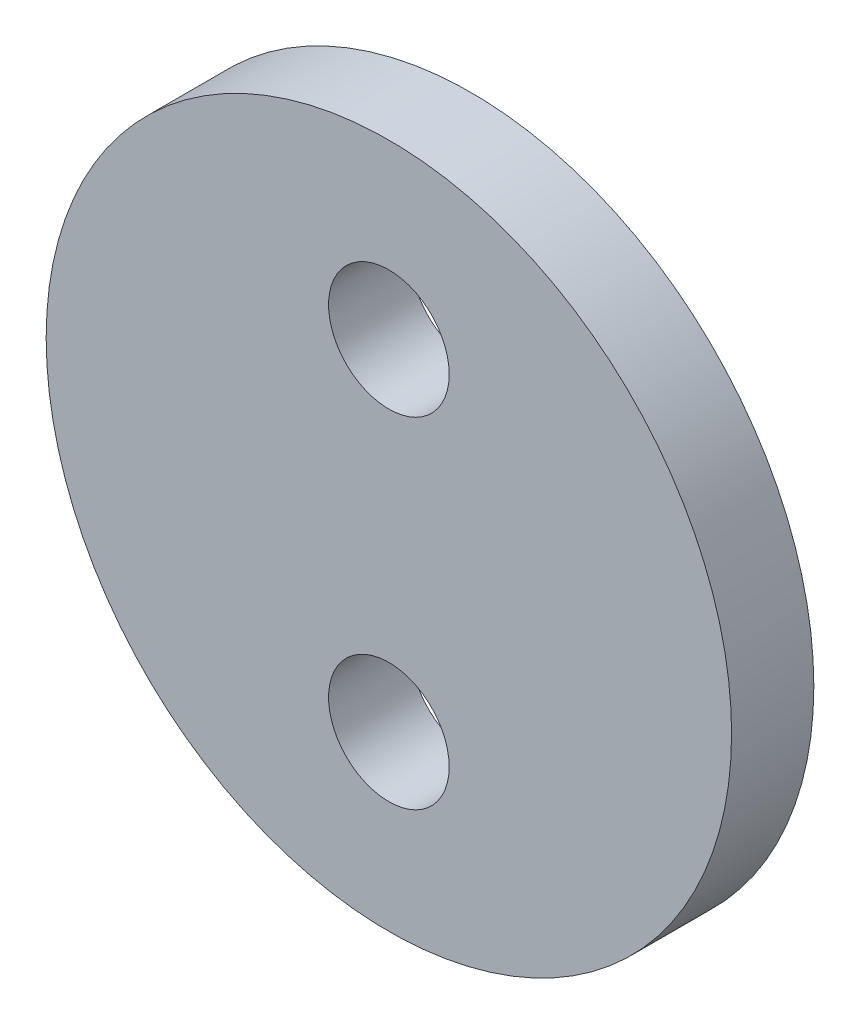
ISO-10303-21;
HEADER;
FILE_DESCRIPTION(('STEP AP214'),'2;1');
FILE_NAME('part.step','',(''),(''),'','','');
FILE_SCHEMA(('AUTOMOTIVE_DESIGN { 1 0 10303 214 1 1 1 1 }'));
ENDSEC;
DATA;
#1=APPLICATION_CONTEXT('core data for automotive mechanical design processes');
#2=APPLICATION_PROTOCOL_DEFINITION('international standard','automotive_design',2000,#1);
#3=PRODUCT_CONTEXT('',#1,'mechanical');
#4=PRODUCT('Part','Part','',(#3));
#5=PRODUCT_RELATED_PRODUCT_CATEGORY('part','',(#4));
#6=PRODUCT_DEFINITION_FORMATION('','',#4);
#7=PRODUCT_DEFINITION_CONTEXT('part definition',#1,'design');
#8=PRODUCT_DEFINITION('design','',#6,#7);
#9=PRODUCT_DEFINITION_SHAPE('','',#8);
#10=(LENGTH_UNIT() NAMED_UNIT(*) SI_UNIT(.MILLI.,.METRE.));
#11=(NAMED_UNIT(*) PLANE_ANGLE_UNIT() SI_UNIT($,.RADIAN.));
#12=(NAMED_UNIT(*) SI_UNIT($,.STERADIAN.) SOLID_ANGLE_UNIT());
#13=UNCERTAINTY_MEASURE_WITH_UNIT(LENGTH_MEASURE(1.E-05),#10,'distance_accuracy_value','');
#14=(GEOMETRIC_REPRESENTATION_CONTEXT(3) GLOBAL_UNCERTAINTY_ASSIGNED_CONTEXT((#13)) GLOBAL_UNIT_ASSIGNED_CONTEXT((#10,
#11,#12)) REPRESENTATION_CONTEXT('',''));
#15=CARTESIAN_POINT('',(0.,0.,0.));
#16=DIRECTION('',(0.,0.,1.));
#17=DIRECTION('',(1.,0.,0.));
#18=AXIS2_PLACEMENT_3D('',#15,#16,#17);
#19=CARTESIAN_POINT('',(0.,0.,3.));
#20=DIRECTION('',(0.,0.,1.));
#21=DIRECTION('',(1.,0.,0.));
#22=AXIS2_PLACEMENT_3D('',#19,#20,#21);
#23=PLANE('',#22);
#24=CARTESIAN_POINT('',(0.,6.2,3.));
#25=DIRECTION('',(0.,0.,1.));
#26=DIRECTION('',(1.,0.,0.));
#27=AXIS2_PLACEMENT_3D('',#24,#25,#26);
#28=CIRCLE('',#27,2.2);
#29=CARTESIAN_POINT('',(2.2,6.2,3.));
#30=VERTEX_POINT('',#29);
#31=EDGE_CURVE('E48',#30,#30,#28,.T.);
#32=ORIENTED_EDGE('',*,*,#31,.F.);
#33=EDGE_LOOP('',(#32));
#34=FACE_BOUND('',#33,.T.);
#35=CARTESIAN_POINT('',(0.,0.,3.));
#36=DIRECTION('',(0.,0.,1.));
#37=DIRECTION('',(1.,0.,0.));
#38=AXIS2_PLACEMENT_3D('',#35,#36,#37);
#39=CIRCLE('',#38,12.5);
#40=CARTESIAN_POINT('',(12.5,0.,3.));
#41=VERTEX_POINT('',#40);
#42=EDGE_CURVE('E10',#41,#41,#39,.T.);
#43=ORIENTED_EDGE('',*,*,#42,.T.);
#44=EDGE_LOOP('',(#43));
#45=FACE_BOUND('',#44,.T.);
#46=CARTESIAN_POINT('',(0.,-6.2,3.));
#47=DIRECTION('',(0.,0.,1.));
#48=DIRECTION('',(1.,0.,0.));
#49=AXIS2_PLACEMENT_3D('',#46,#47,#48);
#50=CIRCLE('',#49,2.2);
#51=CARTESIAN_POINT('',(2.2,-6.2,3.));
#52=VERTEX_POINT('',#51);
#53=EDGE_CURVE('E53',#52,#52,#50,.T.);
#54=ORIENTED_EDGE('',*,*,#53,.F.);
#55=EDGE_LOOP('',(#54));
#56=FACE_BOUND('',#55,.T.);
#57=ADVANCED_FACE('F37',(#34,#45,#56),#23,.T.);
#58=CARTESIAN_POINT('',(0.,0.,0.));
#59=DIRECTION('',(0.,0.,1.));
#60=DIRECTION('',(1.,0.,0.));
#61=AXIS2_PLACEMENT_3D('',#58,#59,#60);
#62=PLANE('',#61);
#63=CARTESIAN_POINT('',(0.,0.,0.));
#64=DIRECTION('',(0.,0.,1.));
#65=DIRECTION('',(1.,0.,0.));
#66=AXIS2_PLACEMENT_3D('',#63,#64,#65);
#67=CIRCLE('',#66,12.5);
#68=CARTESIAN_POINT('',(12.5,0.,0.));
#69=VERTEX_POINT('',#68);
#70=EDGE_CURVE('E41',#69,#69,#67,.T.);
#71=ORIENTED_EDGE('',*,*,#70,.F.);
#72=EDGE_LOOP('',(#71));
#73=FACE_BOUND('',#72,.T.);
#74=CARTESIAN_POINT('',(0.,6.2,0.));
#75=DIRECTION('',(0.,0.,1.));
#76=DIRECTION('',(1.,0.,0.));
#77=AXIS2_PLACEMENT_3D('',#74,#75,#76);
#78=CIRCLE('',#77,2.2);
#79=CARTESIAN_POINT('',(2.2,6.2,0.));
#80=VERTEX_POINT('',#79);
#81=EDGE_CURVE('E50',#80,#80,#78,.T.);
#82=ORIENTED_EDGE('',*,*,#81,.T.);
#83=EDGE_LOOP('',(#82));
#84=FACE_BOUND('',#83,.T.);
#85=CARTESIAN_POINT('',(0.,-6.2,0.));
#86=DIRECTION('',(0.,0.,1.));
#87=DIRECTION('',(1.,0.,0.));
#88=AXIS2_PLACEMENT_3D('',#85,#86,#87);
#89=CIRCLE('',#88,2.2);
#90=CARTESIAN_POINT('',(2.2,-6.2,0.));
#91=VERTEX_POINT('',#90);
#92=EDGE_CURVE('E56',#91,#91,#89,.T.);
#93=ORIENTED_EDGE('',*,*,#92,.T.);
#94=EDGE_LOOP('',(#93));
#95=FACE_BOUND('',#94,.T.);
#96=ADVANCED_FACE('F66',(#73,#84,#95),#62,.F.);
#97=CARTESIAN_POINT('',(0.,0.,3.));
#98=DIRECTION('',(0.,0.,-1.));
#99=DIRECTION('',(-1.,0.,0.));
#100=AXIS2_PLACEMENT_3D('',#97,#98,#99);
#101=CYLINDRICAL_SURFACE('',#100,12.5);
#102=ORIENTED_EDGE('',*,*,#42,.F.);
#103=EDGE_LOOP('',(#102));
#104=FACE_BOUND('',#103,.T.);
#105=ORIENTED_EDGE('',*,*,#70,.T.);
#106=EDGE_LOOP('',(#105));
#107=FACE_BOUND('',#106,.T.);
#108=ADVANCED_FACE('F39',(#104,#107),#101,.T.);
#109=CARTESIAN_POINT('',(0.,6.2,3.));
#110=DIRECTION('',(0.,0.,-1.));
#111=DIRECTION('',(-1.,0.,0.));
#112=AXIS2_PLACEMENT_3D('',#109,#110,#111);
#113=CYLINDRICAL_SURFACE('',#112,2.2);
#114=ORIENTED_EDGE('',*,*,#31,.T.);
#115=EDGE_LOOP('',(#114));
#116=FACE_BOUND('',#115,.T.);
#117=ORIENTED_EDGE('',*,*,#81,.F.);
#118=EDGE_LOOP('',(#117));
#119=FACE_BOUND('',#118,.T.);
#120=ADVANCED_FACE('F75',(#116,#119),#113,.F.);
#121=CARTESIAN_POINT('',(0.,-6.2,3.));
#122=DIRECTION('',(0.,0.,-1.));
#123=DIRECTION('',(-1.,0.,0.));
#124=AXIS2_PLACEMENT_3D('',#121,#122,#123);
#125=CYLINDRICAL_SURFACE('',#124,2.2);
#126=ORIENTED_EDGE('',*,*,#53,.T.);
#127=EDGE_LOOP('',(#126));
#128=FACE_BOUND('',#127,.T.);
#129=ORIENTED_EDGE('',*,*,#92,.F.);
#130=EDGE_LOOP('',(#129));
#131=FACE_BOUND('',#130,.T.);
#132=ADVANCED_FACE('F62',(#128,#131),#125,.F.);
#133=CLOSED_SHELL('',(#57,#96,#108,#120,#132));
#134=MANIFOLD_SOLID_BREP('B2',#133);
#135=ADVANCED_BREP_SHAPE_REPRESENTATION('',(#18,#134),#14);
#136=SHAPE_DEFINITION_REPRESENTATION(#9,#135);
ENDSEC;
END-ISO-10303-21;
